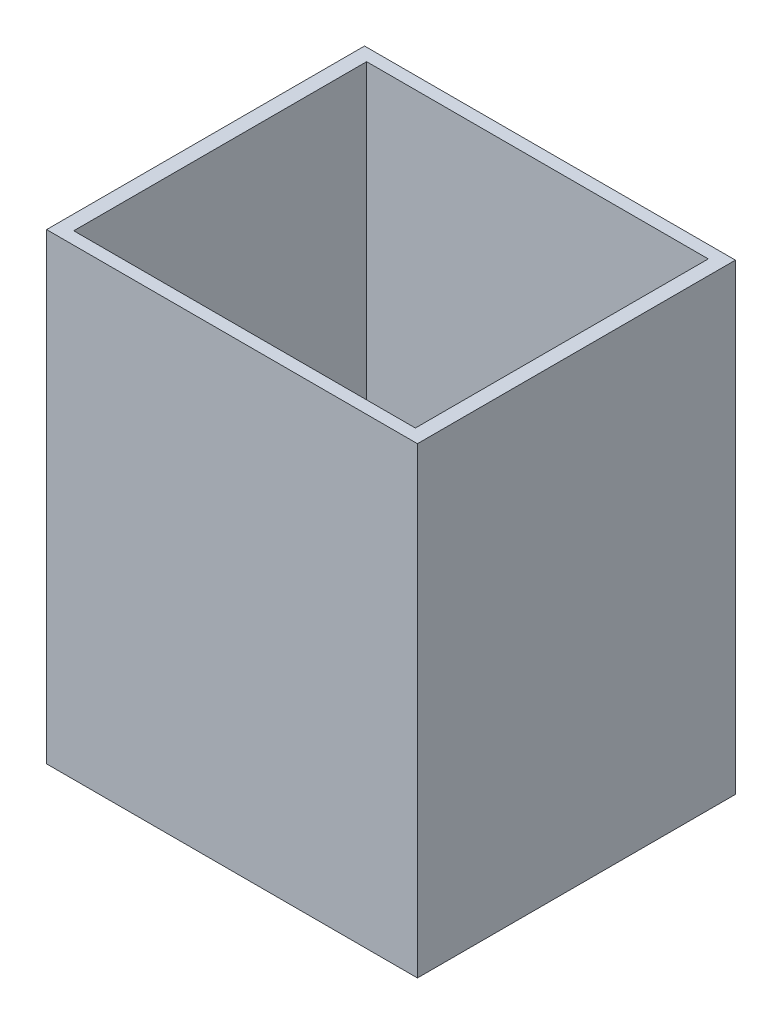
ISO-10303-21;
HEADER;
FILE_DESCRIPTION(('STEP AP214'),'2;1');
FILE_NAME('part.step','',(''),(''),'','','');
FILE_SCHEMA(('AUTOMOTIVE_DESIGN { 1 0 10303 214 1 1 1 1 }'));
ENDSEC;
DATA;
#1=APPLICATION_CONTEXT('core data for automotive mechanical design processes');
#2=APPLICATION_PROTOCOL_DEFINITION('international standard','automotive_design',2000,#1);
#3=PRODUCT_CONTEXT('',#1,'mechanical');
#4=PRODUCT('Part','Part','',(#3));
#5=PRODUCT_RELATED_PRODUCT_CATEGORY('part','',(#4));
#6=PRODUCT_DEFINITION_FORMATION('','',#4);
#7=PRODUCT_DEFINITION_CONTEXT('part definition',#1,'design');
#8=PRODUCT_DEFINITION('design','',#6,#7);
#9=PRODUCT_DEFINITION_SHAPE('','',#8);
#10=(LENGTH_UNIT() NAMED_UNIT(*) SI_UNIT(.MILLI.,.METRE.));
#11=(NAMED_UNIT(*) PLANE_ANGLE_UNIT() SI_UNIT($,.RADIAN.));
#12=(NAMED_UNIT(*) SI_UNIT($,.STERADIAN.) SOLID_ANGLE_UNIT());
#13=UNCERTAINTY_MEASURE_WITH_UNIT(LENGTH_MEASURE(1.E-05),#10,'distance_accuracy_value','');
#14=(GEOMETRIC_REPRESENTATION_CONTEXT(3) GLOBAL_UNCERTAINTY_ASSIGNED_CONTEXT((#13)) GLOBAL_UNIT_ASSIGNED_CONTEXT((#10,
#11,#12)) REPRESENTATION_CONTEXT('',''));
#15=CARTESIAN_POINT('',(0.,0.,0.));
#16=DIRECTION('',(0.,0.,1.));
#17=DIRECTION('',(1.,0.,0.));
#18=AXIS2_PLACEMENT_3D('',#15,#16,#17);
#19=CARTESIAN_POINT('',(0.,0.,0.));
#20=DIRECTION('',(0.,1.,0.));
#21=DIRECTION('',(0.,0.,1.));
#22=AXIS2_PLACEMENT_3D('',#19,#20,#21);
#23=PLANE('',#22);
#24=DIRECTION('',(-1.,0.,0.));
#25=VECTOR('',#24,1.);
#26=CARTESIAN_POINT('',(34.93,0.,29.9478644602049));
#27=LINE('',#26,#25);
#28=CARTESIAN_POINT('',(34.93,0.,29.9478644602049));
#29=VERTEX_POINT('',#28);
#30=CARTESIAN_POINT('',(-34.93,0.,29.9478644602049));
#31=VERTEX_POINT('',#30);
#32=EDGE_CURVE('E214',#29,#31,#27,.T.);
#33=ORIENTED_EDGE('',*,*,#32,.T.);
#34=DIRECTION('',(0.,0.,-1.));
#35=VECTOR('',#34,1.);
#36=CARTESIAN_POINT('',(-34.93,0.,-29.9478644602049));
#37=LINE('',#36,#35);
#38=CARTESIAN_POINT('',(-34.93,0.,-29.9478644602049));
#39=VERTEX_POINT('',#38);
#40=EDGE_CURVE('E204',#31,#39,#37,.T.);
#41=ORIENTED_EDGE('',*,*,#40,.T.);
#42=DIRECTION('',(1.,0.,0.));
#43=VECTOR('',#42,1.);
#44=CARTESIAN_POINT('',(34.93,0.,-29.9478644602049));
#45=LINE('',#44,#43);
#46=CARTESIAN_POINT('',(34.93,0.,-29.9478644602049));
#47=VERTEX_POINT('',#46);
#48=EDGE_CURVE('E224',#39,#47,#45,.T.);
#49=ORIENTED_EDGE('',*,*,#48,.T.);
#50=DIRECTION('',(0.,0.,1.));
#51=VECTOR('',#50,1.);
#52=CARTESIAN_POINT('',(34.93,0.,-29.9478644602049));
#53=LINE('',#52,#51);
#54=EDGE_CURVE('E227',#47,#29,#53,.T.);
#55=ORIENTED_EDGE('',*,*,#54,.T.);
#56=EDGE_LOOP('',(#33,#41,#49,#55));
#57=FACE_BOUND('',#56,.T.);
#58=DIRECTION('',(0.,0.,-1.));
#59=VECTOR('',#58,1.);
#60=CARTESIAN_POINT('',(-31.79,0.,-27.2557289204098));
#61=LINE('',#60,#59);
#62=CARTESIAN_POINT('',(-31.79,0.,27.2557289204098));
#63=VERTEX_POINT('',#62);
#64=CARTESIAN_POINT('',(-31.79,0.,-27.2557289204098));
#65=VERTEX_POINT('',#64);
#66=EDGE_CURVE('E172',#63,#65,#61,.T.);
#67=ORIENTED_EDGE('',*,*,#66,.F.);
#68=DIRECTION('',(-1.,0.,0.));
#69=VECTOR('',#68,1.);
#70=CARTESIAN_POINT('',(31.79,0.,27.2557289204098));
#71=LINE('',#70,#69);
#72=CARTESIAN_POINT('',(31.79,0.,27.2557289204098));
#73=VERTEX_POINT('',#72);
#74=EDGE_CURVE('E169',#73,#63,#71,.T.);
#75=ORIENTED_EDGE('',*,*,#74,.F.);
#76=DIRECTION('',(0.,0.,1.));
#77=VECTOR('',#76,1.);
#78=CARTESIAN_POINT('',(31.79,0.,-27.2557289204098));
#79=LINE('',#78,#77);
#80=CARTESIAN_POINT('',(31.79,0.,-27.2557289204098));
#81=VERTEX_POINT('',#80);
#82=EDGE_CURVE('E60',#81,#73,#79,.T.);
#83=ORIENTED_EDGE('',*,*,#82,.F.);
#84=DIRECTION('',(1.,0.,0.));
#85=VECTOR('',#84,1.);
#86=CARTESIAN_POINT('',(31.79,0.,-27.2557289204098));
#87=LINE('',#86,#85);
#88=EDGE_CURVE('E55',#65,#81,#87,.T.);
#89=ORIENTED_EDGE('',*,*,#88,.F.);
#90=EDGE_LOOP('',(#67,#75,#83,#89));
#91=FACE_BOUND('',#90,.T.);
#92=ADVANCED_FACE('F40',(#57,#91),#23,.F.);
#93=CARTESIAN_POINT('',(38.07,80.,-32.64));
#94=DIRECTION('',(-1.,0.,0.));
#95=DIRECTION('',(0.,0.,1.));
#96=AXIS2_PLACEMENT_3D('',#93,#94,#95);
#97=PLANE('',#96);
#98=DIRECTION('',(0.,-1.,0.));
#99=VECTOR('',#98,1.);
#100=CARTESIAN_POINT('',(38.07,80.,32.64));
#101=LINE('',#100,#99);
#102=CARTESIAN_POINT('',(38.07,80.,32.64));
#103=VERTEX_POINT('',#102);
#104=CARTESIAN_POINT('',(38.07,-15.,32.64));
#105=VERTEX_POINT('',#104);
#106=EDGE_CURVE('E261',#103,#105,#101,.T.);
#107=ORIENTED_EDGE('',*,*,#106,.T.);
#108=DIRECTION('',(0.,0.,1.));
#109=VECTOR('',#108,1.);
#110=CARTESIAN_POINT('',(38.07,-15.,-32.64));
#111=LINE('',#110,#109);
#112=CARTESIAN_POINT('',(38.07,-15.,-32.64));
#113=VERTEX_POINT('',#112);
#114=EDGE_CURVE('E246',#113,#105,#111,.T.);
#115=ORIENTED_EDGE('',*,*,#114,.F.);
#116=DIRECTION('',(0.,-1.,0.));
#117=VECTOR('',#116,1.);
#118=CARTESIAN_POINT('',(38.07,80.,-32.64));
#119=LINE('',#118,#117);
#120=CARTESIAN_POINT('',(38.07,80.,-32.64));
#121=VERTEX_POINT('',#120);
#122=EDGE_CURVE('E11',#121,#113,#119,.T.);
#123=ORIENTED_EDGE('',*,*,#122,.F.);
#124=DIRECTION('',(0.,0.,-1.));
#125=VECTOR('',#124,1.);
#126=CARTESIAN_POINT('',(38.07,80.,-32.64));
#127=LINE('',#126,#125);
#128=EDGE_CURVE('E252',#103,#121,#127,.T.);
#129=ORIENTED_EDGE('',*,*,#128,.F.);
#130=EDGE_LOOP('',(#107,#115,#123,#129));
#131=FACE_BOUND('',#130,.T.);
#132=ADVANCED_FACE('F42',(#131),#97,.F.);
#133=CARTESIAN_POINT('',(-38.07,80.,-32.64));
#134=DIRECTION('',(0.,0.,1.));
#135=DIRECTION('',(1.,0.,0.));
#136=AXIS2_PLACEMENT_3D('',#133,#134,#135);
#137=PLANE('',#136);
#138=ORIENTED_EDGE('',*,*,#122,.T.);
#139=DIRECTION('',(1.,0.,0.));
#140=VECTOR('',#139,1.);
#141=CARTESIAN_POINT('',(38.07,-15.,-32.64));
#142=LINE('',#141,#140);
#143=CARTESIAN_POINT('',(-38.07,-15.,-32.64));
#144=VERTEX_POINT('',#143);
#145=EDGE_CURVE('E243',#144,#113,#142,.T.);
#146=ORIENTED_EDGE('',*,*,#145,.F.);
#147=DIRECTION('',(0.,-1.,0.));
#148=VECTOR('',#147,1.);
#149=CARTESIAN_POINT('',(-38.07,80.,-32.64));
#150=LINE('',#149,#148);
#151=CARTESIAN_POINT('',(-38.07,80.,-32.64));
#152=VERTEX_POINT('',#151);
#153=EDGE_CURVE('E48',#152,#144,#150,.T.);
#154=ORIENTED_EDGE('',*,*,#153,.F.);
#155=DIRECTION('',(-1.,0.,0.));
#156=VECTOR('',#155,1.);
#157=CARTESIAN_POINT('',(-38.07,80.,-32.64));
#158=LINE('',#157,#156);
#159=EDGE_CURVE('E255',#121,#152,#158,.T.);
#160=ORIENTED_EDGE('',*,*,#159,.F.);
#161=EDGE_LOOP('',(#138,#146,#154,#160));
#162=FACE_BOUND('',#161,.T.);
#163=ADVANCED_FACE('F272',(#162),#137,.F.);
#164=CARTESIAN_POINT('',(-38.07,80.,-32.64));
#165=DIRECTION('',(1.,0.,0.));
#166=DIRECTION('',(0.,0.,-1.));
#167=AXIS2_PLACEMENT_3D('',#164,#165,#166);
#168=PLANE('',#167);
#169=ORIENTED_EDGE('',*,*,#153,.T.);
#170=DIRECTION('',(0.,0.,-1.));
#171=VECTOR('',#170,1.);
#172=CARTESIAN_POINT('',(-38.07,-15.,-32.64));
#173=LINE('',#172,#171);
#174=CARTESIAN_POINT('',(-38.07,-15.,32.64));
#175=VERTEX_POINT('',#174);
#176=EDGE_CURVE('E240',#175,#144,#173,.T.);
#177=ORIENTED_EDGE('',*,*,#176,.F.);
#178=DIRECTION('',(0.,-1.,0.));
#179=VECTOR('',#178,1.);
#180=CARTESIAN_POINT('',(-38.07,80.,32.64));
#181=LINE('',#180,#179);
#182=CARTESIAN_POINT('',(-38.07,80.,32.64));
#183=VERTEX_POINT('',#182);
#184=EDGE_CURVE('E263',#183,#175,#181,.T.);
#185=ORIENTED_EDGE('',*,*,#184,.F.);
#186=DIRECTION('',(0.,0.,1.));
#187=VECTOR('',#186,1.);
#188=CARTESIAN_POINT('',(-38.07,80.,-32.64));
#189=LINE('',#188,#187);
#190=EDGE_CURVE('E257',#152,#183,#189,.T.);
#191=ORIENTED_EDGE('',*,*,#190,.F.);
#192=EDGE_LOOP('',(#169,#177,#185,#191));
#193=FACE_BOUND('',#192,.T.);
#194=ADVANCED_FACE('F269',(#193),#168,.F.);
#195=CARTESIAN_POINT('',(-38.07,80.,32.64));
#196=DIRECTION('',(0.,0.,-1.));
#197=DIRECTION('',(-1.,0.,0.));
#198=AXIS2_PLACEMENT_3D('',#195,#196,#197);
#199=PLANE('',#198);
#200=ORIENTED_EDGE('',*,*,#184,.T.);
#201=DIRECTION('',(-1.,0.,0.));
#202=VECTOR('',#201,1.);
#203=CARTESIAN_POINT('',(38.07,-15.,32.64));
#204=LINE('',#203,#202);
#205=EDGE_CURVE('E249',#105,#175,#204,.T.);
#206=ORIENTED_EDGE('',*,*,#205,.F.);
#207=ORIENTED_EDGE('',*,*,#106,.F.);
#208=DIRECTION('',(1.,0.,0.));
#209=VECTOR('',#208,1.);
#210=CARTESIAN_POINT('',(-38.07,80.,32.64));
#211=LINE('',#210,#209);
#212=EDGE_CURVE('E259',#183,#103,#211,.T.);
#213=ORIENTED_EDGE('',*,*,#212,.F.);
#214=EDGE_LOOP('',(#200,#206,#207,#213));
#215=FACE_BOUND('',#214,.T.);
#216=ADVANCED_FACE('F281',(#215),#199,.F.);
#217=CARTESIAN_POINT('',(0.,80.,0.));
#218=DIRECTION('',(0.,1.,0.));
#219=DIRECTION('',(0.,0.,1.));
#220=AXIS2_PLACEMENT_3D('',#217,#218,#219);
#221=PLANE('',#220);
#222=DIRECTION('',(0.,0.,1.));
#223=VECTOR('',#222,1.);
#224=CARTESIAN_POINT('',(-35.07,80.,30.0678959810875));
#225=LINE('',#224,#223);
#226=CARTESIAN_POINT('',(-35.07,80.,-30.0678959810875));
#227=VERTEX_POINT('',#226);
#228=CARTESIAN_POINT('',(-35.07,80.,30.0678959810875));
#229=VERTEX_POINT('',#228);
#230=EDGE_CURVE('E173',#227,#229,#225,.T.);
#231=ORIENTED_EDGE('',*,*,#230,.F.);
#232=DIRECTION('',(-1.,0.,0.));
#233=VECTOR('',#232,1.);
#234=CARTESIAN_POINT('',(35.07,80.,-30.0678959810875));
#235=LINE('',#234,#233);
#236=CARTESIAN_POINT('',(35.07,80.,-30.0678959810875));
#237=VERTEX_POINT('',#236);
#238=EDGE_CURVE('E185',#237,#227,#235,.T.);
#239=ORIENTED_EDGE('',*,*,#238,.F.);
#240=DIRECTION('',(0.,0.,-1.));
#241=VECTOR('',#240,1.);
#242=CARTESIAN_POINT('',(35.07,80.,30.0678959810875));
#243=LINE('',#242,#241);
#244=CARTESIAN_POINT('',(35.07,80.,30.0678959810875));
#245=VERTEX_POINT('',#244);
#246=EDGE_CURVE('E197',#245,#237,#243,.T.);
#247=ORIENTED_EDGE('',*,*,#246,.F.);
#248=DIRECTION('',(1.,0.,0.));
#249=VECTOR('',#248,1.);
#250=CARTESIAN_POINT('',(35.07,80.,30.0678959810875));
#251=LINE('',#250,#249);
#252=EDGE_CURVE('E175',#229,#245,#251,.T.);
#253=ORIENTED_EDGE('',*,*,#252,.F.);
#254=EDGE_LOOP('',(#231,#239,#247,#253));
#255=FACE_BOUND('',#254,.T.);
#256=ORIENTED_EDGE('',*,*,#128,.T.);
#257=ORIENTED_EDGE('',*,*,#159,.T.);
#258=ORIENTED_EDGE('',*,*,#190,.T.);
#259=ORIENTED_EDGE('',*,*,#212,.T.);
#260=EDGE_LOOP('',(#256,#257,#258,#259));
#261=FACE_BOUND('',#260,.T.);
#262=ADVANCED_FACE('F285',(#255,#261),#221,.T.);
#263=CARTESIAN_POINT('',(0.,-15.,0.));
#264=DIRECTION('',(0.,-1.,0.));
#265=DIRECTION('',(0.,0.,-1.));
#266=AXIS2_PLACEMENT_3D('',#263,#264,#265);
#267=PLANE('',#266);
#268=ORIENTED_EDGE('',*,*,#176,.T.);
#269=ORIENTED_EDGE('',*,*,#145,.T.);
#270=ORIENTED_EDGE('',*,*,#114,.T.);
#271=ORIENTED_EDGE('',*,*,#205,.T.);
#272=EDGE_LOOP('',(#268,#269,#270,#271));
#273=FACE_BOUND('',#272,.T.);
#274=DIRECTION('',(1.,0.,0.));
#275=VECTOR('',#274,1.);
#276=CARTESIAN_POINT('',(34.93,-15.,-29.9478644602049));
#277=LINE('',#276,#275);
#278=CARTESIAN_POINT('',(-34.93,-15.,-29.9478644602049));
#279=VERTEX_POINT('',#278);
#280=CARTESIAN_POINT('',(34.93,-15.,-29.9478644602049));
#281=VERTEX_POINT('',#280);
#282=EDGE_CURVE('E213',#279,#281,#277,.T.);
#283=ORIENTED_EDGE('',*,*,#282,.F.);
#284=DIRECTION('',(0.,0.,-1.));
#285=VECTOR('',#284,1.);
#286=CARTESIAN_POINT('',(-34.93,-15.,-29.9478644602049));
#287=LINE('',#286,#285);
#288=CARTESIAN_POINT('',(-34.93,-15.,29.9478644602049));
#289=VERTEX_POINT('',#288);
#290=EDGE_CURVE('E211',#289,#279,#287,.T.);
#291=ORIENTED_EDGE('',*,*,#290,.F.);
#292=DIRECTION('',(-1.,0.,0.));
#293=VECTOR('',#292,1.);
#294=CARTESIAN_POINT('',(34.93,-15.,29.9478644602049));
#295=LINE('',#294,#293);
#296=CARTESIAN_POINT('',(34.93,-15.,29.9478644602049));
#297=VERTEX_POINT('',#296);
#298=EDGE_CURVE('E219',#297,#289,#295,.T.);
#299=ORIENTED_EDGE('',*,*,#298,.F.);
#300=DIRECTION('',(0.,0.,1.));
#301=VECTOR('',#300,1.);
#302=CARTESIAN_POINT('',(34.93,-15.,-29.9478644602049));
#303=LINE('',#302,#301);
#304=EDGE_CURVE('E216',#281,#297,#303,.T.);
#305=ORIENTED_EDGE('',*,*,#304,.F.);
#306=EDGE_LOOP('',(#283,#291,#299,#305));
#307=FACE_BOUND('',#306,.T.);
#308=ADVANCED_FACE('F276',(#273,#307),#267,.T.);
#309=CARTESIAN_POINT('',(-34.93,-15.,-29.9478644602049));
#310=DIRECTION('',(1.,0.,0.));
#311=DIRECTION('',(0.,0.,-1.));
#312=AXIS2_PLACEMENT_3D('',#309,#310,#311);
#313=PLANE('',#312);
#314=ORIENTED_EDGE('',*,*,#40,.F.);
#315=DIRECTION('',(0.,1.,0.));
#316=VECTOR('',#315,1.);
#317=CARTESIAN_POINT('',(-34.93,-15.,29.9478644602049));
#318=LINE('',#317,#316);
#319=EDGE_CURVE('E221',#289,#31,#318,.T.);
#320=ORIENTED_EDGE('',*,*,#319,.F.);
#321=ORIENTED_EDGE('',*,*,#290,.T.);
#322=DIRECTION('',(0.,1.,0.));
#323=VECTOR('',#322,1.);
#324=CARTESIAN_POINT('',(-34.93,-15.,-29.9478644602049));
#325=LINE('',#324,#323);
#326=EDGE_CURVE('E237',#279,#39,#325,.T.);
#327=ORIENTED_EDGE('',*,*,#326,.T.);
#328=EDGE_LOOP('',(#314,#320,#321,#327));
#329=FACE_BOUND('',#328,.T.);
#330=ADVANCED_FACE('F324',(#329),#313,.T.);
#331=CARTESIAN_POINT('',(34.93,-15.,-29.9478644602049));
#332=DIRECTION('',(0.,0.,1.));
#333=DIRECTION('',(1.,0.,0.));
#334=AXIS2_PLACEMENT_3D('',#331,#332,#333);
#335=PLANE('',#334);
#336=ORIENTED_EDGE('',*,*,#48,.F.);
#337=ORIENTED_EDGE('',*,*,#326,.F.);
#338=ORIENTED_EDGE('',*,*,#282,.T.);
#339=DIRECTION('',(0.,1.,0.));
#340=VECTOR('',#339,1.);
#341=CARTESIAN_POINT('',(34.93,-15.,-29.9478644602049));
#342=LINE('',#341,#340);
#343=EDGE_CURVE('E235',#281,#47,#342,.T.);
#344=ORIENTED_EDGE('',*,*,#343,.T.);
#345=EDGE_LOOP('',(#336,#337,#338,#344));
#346=FACE_BOUND('',#345,.T.);
#347=ADVANCED_FACE('F330',(#346),#335,.T.);
#348=CARTESIAN_POINT('',(34.93,-15.,-29.9478644602049));
#349=DIRECTION('',(-1.,0.,0.));
#350=DIRECTION('',(0.,0.,1.));
#351=AXIS2_PLACEMENT_3D('',#348,#349,#350);
#352=PLANE('',#351);
#353=ORIENTED_EDGE('',*,*,#54,.F.);
#354=ORIENTED_EDGE('',*,*,#343,.F.);
#355=ORIENTED_EDGE('',*,*,#304,.T.);
#356=DIRECTION('',(0.,1.,0.));
#357=VECTOR('',#356,1.);
#358=CARTESIAN_POINT('',(34.93,-15.,29.9478644602049));
#359=LINE('',#358,#357);
#360=EDGE_CURVE('E233',#297,#29,#359,.T.);
#361=ORIENTED_EDGE('',*,*,#360,.T.);
#362=EDGE_LOOP('',(#353,#354,#355,#361));
#363=FACE_BOUND('',#362,.T.);
#364=ADVANCED_FACE('F338',(#363),#352,.T.);
#365=CARTESIAN_POINT('',(34.93,-15.,29.9478644602049));
#366=DIRECTION('',(0.,0.,-1.));
#367=DIRECTION('',(-1.,0.,0.));
#368=AXIS2_PLACEMENT_3D('',#365,#366,#367);
#369=PLANE('',#368);
#370=ORIENTED_EDGE('',*,*,#32,.F.);
#371=ORIENTED_EDGE('',*,*,#360,.F.);
#372=ORIENTED_EDGE('',*,*,#298,.T.);
#373=ORIENTED_EDGE('',*,*,#319,.T.);
#374=EDGE_LOOP('',(#370,#371,#372,#373));
#375=FACE_BOUND('',#374,.T.);
#376=ADVANCED_FACE('F346',(#375),#369,.T.);
#377=CARTESIAN_POINT('',(-35.07,5.,30.0678959810875));
#378=DIRECTION('',(-1.,0.,0.));
#379=DIRECTION('',(0.,0.,1.));
#380=AXIS2_PLACEMENT_3D('',#377,#378,#379);
#381=PLANE('',#380);
#382=ORIENTED_EDGE('',*,*,#230,.T.);
#383=DIRECTION('',(0.,1.,0.));
#384=VECTOR('',#383,1.);
#385=CARTESIAN_POINT('',(-35.07,5.,30.0678959810875));
#386=LINE('',#385,#384);
#387=CARTESIAN_POINT('',(-35.07,5.,30.0678959810875));
#388=VERTEX_POINT('',#387);
#389=EDGE_CURVE('E193',#388,#229,#386,.T.);
#390=ORIENTED_EDGE('',*,*,#389,.F.);
#391=DIRECTION('',(0.,0.,1.));
#392=VECTOR('',#391,1.);
#393=CARTESIAN_POINT('',(-35.07,5.,30.0678959810875));
#394=LINE('',#393,#392);
#395=CARTESIAN_POINT('',(-35.07,5.,-30.0678959810875));
#396=VERTEX_POINT('',#395);
#397=EDGE_CURVE('E181',#396,#388,#394,.T.);
#398=ORIENTED_EDGE('',*,*,#397,.F.);
#399=DIRECTION('',(0.,1.,0.));
#400=VECTOR('',#399,1.);
#401=CARTESIAN_POINT('',(-35.07,5.,-30.0678959810875));
#402=LINE('',#401,#400);
#403=EDGE_CURVE('E202',#396,#227,#402,.T.);
#404=ORIENTED_EDGE('',*,*,#403,.T.);
#405=EDGE_LOOP('',(#382,#390,#398,#404));
#406=FACE_BOUND('',#405,.T.);
#407=ADVANCED_FACE('F353',(#406),#381,.F.);
#408=CARTESIAN_POINT('',(35.07,5.,-30.0678959810875));
#409=DIRECTION('',(0.,0.,-1.));
#410=DIRECTION('',(-1.,0.,0.));
#411=AXIS2_PLACEMENT_3D('',#408,#409,#410);
#412=PLANE('',#411);
#413=ORIENTED_EDGE('',*,*,#238,.T.);
#414=ORIENTED_EDGE('',*,*,#403,.F.);
#415=DIRECTION('',(-1.,0.,0.));
#416=VECTOR('',#415,1.);
#417=CARTESIAN_POINT('',(35.07,5.,-30.0678959810875));
#418=LINE('',#417,#416);
#419=CARTESIAN_POINT('',(35.07,5.,-30.0678959810875));
#420=VERTEX_POINT('',#419);
#421=EDGE_CURVE('E191',#420,#396,#418,.T.);
#422=ORIENTED_EDGE('',*,*,#421,.F.);
#423=DIRECTION('',(0.,1.,0.));
#424=VECTOR('',#423,1.);
#425=CARTESIAN_POINT('',(35.07,5.,-30.0678959810875));
#426=LINE('',#425,#424);
#427=EDGE_CURVE('E205',#420,#237,#426,.T.);
#428=ORIENTED_EDGE('',*,*,#427,.T.);
#429=EDGE_LOOP('',(#413,#414,#422,#428));
#430=FACE_BOUND('',#429,.T.);
#431=ADVANCED_FACE('F360',(#430),#412,.F.);
#432=CARTESIAN_POINT('',(35.07,5.,30.0678959810875));
#433=DIRECTION('',(1.,0.,0.));
#434=DIRECTION('',(0.,0.,-1.));
#435=AXIS2_PLACEMENT_3D('',#432,#433,#434);
#436=PLANE('',#435);
#437=ORIENTED_EDGE('',*,*,#246,.T.);
#438=ORIENTED_EDGE('',*,*,#427,.F.);
#439=DIRECTION('',(0.,0.,-1.));
#440=VECTOR('',#439,1.);
#441=CARTESIAN_POINT('',(35.07,5.,30.0678959810875));
#442=LINE('',#441,#440);
#443=CARTESIAN_POINT('',(35.07,5.,30.0678959810875));
#444=VERTEX_POINT('',#443);
#445=EDGE_CURVE('E188',#444,#420,#442,.T.);
#446=ORIENTED_EDGE('',*,*,#445,.F.);
#447=DIRECTION('',(0.,1.,0.));
#448=VECTOR('',#447,1.);
#449=CARTESIAN_POINT('',(35.07,5.,30.0678959810875));
#450=LINE('',#449,#448);
#451=EDGE_CURVE('E207',#444,#245,#450,.T.);
#452=ORIENTED_EDGE('',*,*,#451,.T.);
#453=EDGE_LOOP('',(#437,#438,#446,#452));
#454=FACE_BOUND('',#453,.T.);
#455=ADVANCED_FACE('F368',(#454),#436,.F.);
#456=CARTESIAN_POINT('',(35.07,5.,30.0678959810875));
#457=DIRECTION('',(0.,0.,1.));
#458=DIRECTION('',(1.,0.,0.));
#459=AXIS2_PLACEMENT_3D('',#456,#457,#458);
#460=PLANE('',#459);
#461=ORIENTED_EDGE('',*,*,#252,.T.);
#462=ORIENTED_EDGE('',*,*,#451,.F.);
#463=DIRECTION('',(1.,0.,0.));
#464=VECTOR('',#463,1.);
#465=CARTESIAN_POINT('',(35.07,5.,30.0678959810875));
#466=LINE('',#465,#464);
#467=EDGE_CURVE('E184',#388,#444,#466,.T.);
#468=ORIENTED_EDGE('',*,*,#467,.F.);
#469=ORIENTED_EDGE('',*,*,#389,.T.);
#470=EDGE_LOOP('',(#461,#462,#468,#469));
#471=FACE_BOUND('',#470,.T.);
#472=ADVANCED_FACE('F376',(#471),#460,.F.);
#473=CARTESIAN_POINT('',(0.,5.,0.));
#474=DIRECTION('',(0.,1.,0.));
#475=DIRECTION('',(0.,0.,1.));
#476=AXIS2_PLACEMENT_3D('',#473,#474,#475);
#477=PLANE('',#476);
#478=ORIENTED_EDGE('',*,*,#397,.T.);
#479=ORIENTED_EDGE('',*,*,#467,.T.);
#480=ORIENTED_EDGE('',*,*,#445,.T.);
#481=ORIENTED_EDGE('',*,*,#421,.T.);
#482=EDGE_LOOP('',(#478,#479,#480,#481));
#483=FACE_BOUND('',#482,.T.);
#484=ADVANCED_FACE('F384',(#483),#477,.T.);
#485=CARTESIAN_POINT('',(-31.79,-15.,-27.2557289204098));
#486=DIRECTION('',(1.,0.,0.));
#487=DIRECTION('',(0.,0.,-1.));
#488=AXIS2_PLACEMENT_3D('',#485,#486,#487);
#489=PLANE('',#488);
#490=ORIENTED_EDGE('',*,*,#66,.T.);
#491=DIRECTION('',(0.,1.,0.));
#492=VECTOR('',#491,1.);
#493=CARTESIAN_POINT('',(-31.79,-15.,-27.2557289204098));
#494=LINE('',#493,#492);
#495=CARTESIAN_POINT('',(-31.79,-15.,-27.2557289204098));
#496=VERTEX_POINT('',#495);
#497=EDGE_CURVE('E153',#496,#65,#494,.T.);
#498=ORIENTED_EDGE('',*,*,#497,.F.);
#499=DIRECTION('',(0.,0.,-1.));
#500=VECTOR('',#499,1.);
#501=CARTESIAN_POINT('',(-31.79,-15.,-27.2557289204098));
#502=LINE('',#501,#500);
#503=CARTESIAN_POINT('',(-31.79,-15.,27.2557289204098));
#504=VERTEX_POINT('',#503);
#505=EDGE_CURVE('E160',#504,#496,#502,.T.);
#506=ORIENTED_EDGE('',*,*,#505,.F.);
#507=DIRECTION('',(0.,1.,0.));
#508=VECTOR('',#507,1.);
#509=CARTESIAN_POINT('',(-31.79,-15.,27.2557289204098));
#510=LINE('',#509,#508);
#511=EDGE_CURVE('E491',#504,#63,#510,.T.);
#512=ORIENTED_EDGE('',*,*,#511,.T.);
#513=EDGE_LOOP('',(#490,#498,#506,#512));
#514=FACE_BOUND('',#513,.T.);
#515=ADVANCED_FACE('F171',(#514),#489,.F.);
#516=CARTESIAN_POINT('',(31.79,-15.,-27.2557289204098));
#517=DIRECTION('',(0.,0.,1.));
#518=DIRECTION('',(1.,0.,0.));
#519=AXIS2_PLACEMENT_3D('',#516,#517,#518);
#520=PLANE('',#519);
#521=ORIENTED_EDGE('',*,*,#88,.T.);
#522=DIRECTION('',(0.,1.,0.));
#523=VECTOR('',#522,1.);
#524=CARTESIAN_POINT('',(31.79,-15.,-27.2557289204098));
#525=LINE('',#524,#523);
#526=CARTESIAN_POINT('',(31.79,-15.,-27.2557289204098));
#527=VERTEX_POINT('',#526);
#528=EDGE_CURVE('E156',#527,#81,#525,.T.);
#529=ORIENTED_EDGE('',*,*,#528,.F.);
#530=DIRECTION('',(1.,0.,0.));
#531=VECTOR('',#530,1.);
#532=CARTESIAN_POINT('',(31.79,-15.,-27.2557289204098));
#533=LINE('',#532,#531);
#534=EDGE_CURVE('E149',#496,#527,#533,.T.);
#535=ORIENTED_EDGE('',*,*,#534,.F.);
#536=ORIENTED_EDGE('',*,*,#497,.T.);
#537=EDGE_LOOP('',(#521,#529,#535,#536));
#538=FACE_BOUND('',#537,.T.);
#539=ADVANCED_FACE('F151',(#538),#520,.F.);
#540=CARTESIAN_POINT('',(31.79,-15.,-27.2557289204098));
#541=DIRECTION('',(-1.,0.,0.));
#542=DIRECTION('',(0.,0.,1.));
#543=AXIS2_PLACEMENT_3D('',#540,#541,#542);
#544=PLANE('',#543);
#545=ORIENTED_EDGE('',*,*,#82,.T.);
#546=DIRECTION('',(0.,1.,0.));
#547=VECTOR('',#546,1.);
#548=CARTESIAN_POINT('',(31.79,-15.,27.2557289204098));
#549=LINE('',#548,#547);
#550=CARTESIAN_POINT('',(31.79,-15.,27.2557289204098));
#551=VERTEX_POINT('',#550);
#552=EDGE_CURVE('E177',#551,#73,#549,.T.);
#553=ORIENTED_EDGE('',*,*,#552,.F.);
#554=DIRECTION('',(0.,0.,1.));
#555=VECTOR('',#554,1.);
#556=CARTESIAN_POINT('',(31.79,-15.,-27.2557289204098));
#557=LINE('',#556,#555);
#558=EDGE_CURVE('E159',#527,#551,#557,.T.);
#559=ORIENTED_EDGE('',*,*,#558,.F.);
#560=ORIENTED_EDGE('',*,*,#528,.T.);
#561=EDGE_LOOP('',(#545,#553,#559,#560));
#562=FACE_BOUND('',#561,.T.);
#563=ADVANCED_FACE('F405',(#562),#544,.F.);
#564=CARTESIAN_POINT('',(31.79,-15.,27.2557289204098));
#565=DIRECTION('',(0.,0.,-1.));
#566=DIRECTION('',(-1.,0.,0.));
#567=AXIS2_PLACEMENT_3D('',#564,#565,#566);
#568=PLANE('',#567);
#569=ORIENTED_EDGE('',*,*,#74,.T.);
#570=ORIENTED_EDGE('',*,*,#511,.F.);
#571=DIRECTION('',(-1.,0.,0.));
#572=VECTOR('',#571,1.);
#573=CARTESIAN_POINT('',(31.79,-15.,27.2557289204098));
#574=LINE('',#573,#572);
#575=EDGE_CURVE('E165',#551,#504,#574,.T.);
#576=ORIENTED_EDGE('',*,*,#575,.F.);
#577=ORIENTED_EDGE('',*,*,#552,.T.);
#578=EDGE_LOOP('',(#569,#570,#576,#577));
#579=FACE_BOUND('',#578,.T.);
#580=ADVANCED_FACE('F412',(#579),#568,.F.);
#581=CARTESIAN_POINT('',(0.,-15.,0.));
#582=DIRECTION('',(0.,-1.,0.));
#583=DIRECTION('',(0.,0.,-1.));
#584=AXIS2_PLACEMENT_3D('',#581,#582,#583);
#585=PLANE('',#584);
#586=ORIENTED_EDGE('',*,*,#505,.T.);
#587=ORIENTED_EDGE('',*,*,#534,.T.);
#588=ORIENTED_EDGE('',*,*,#558,.T.);
#589=ORIENTED_EDGE('',*,*,#575,.T.);
#590=EDGE_LOOP('',(#586,#587,#588,#589));
#591=FACE_BOUND('',#590,.T.);
#592=ADVANCED_FACE('F163',(#591),#585,.T.);
#593=CLOSED_SHELL('',(#92,#132,#163,#194,#216,#262,#308,#330,#347,#364,#376,#407,#431,#455,#472,
#484,#515,#539,#563,#580,#592));
#594=MANIFOLD_SOLID_BREP('B2',#593);
#595=ADVANCED_BREP_SHAPE_REPRESENTATION('',(#18,#594),#14);
#596=SHAPE_DEFINITION_REPRESENTATION(#9,#595);
ENDSEC;
END-ISO-10303-21;
